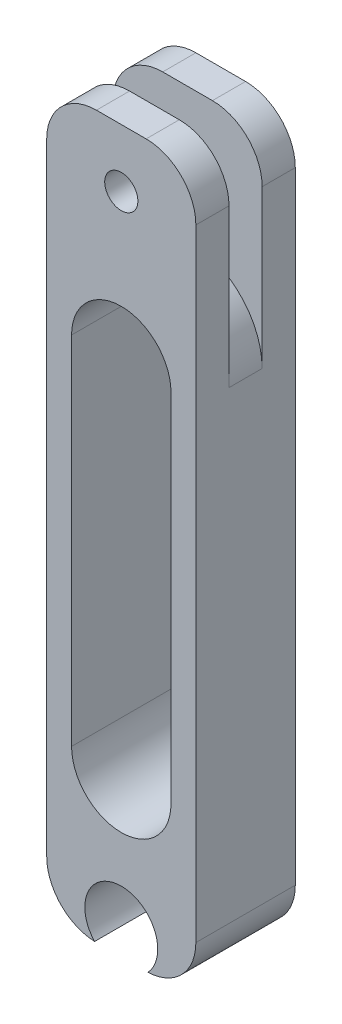
ISO-10303-21;
HEADER;
FILE_DESCRIPTION(('STEP AP214'),'2;1');
FILE_NAME('part.step','',(''),(''),'','','');
FILE_SCHEMA(('AUTOMOTIVE_DESIGN { 1 0 10303 214 1 1 1 1 }'));
ENDSEC;
DATA;
#1=APPLICATION_CONTEXT('core data for automotive mechanical design processes');
#2=APPLICATION_PROTOCOL_DEFINITION('international standard','automotive_design',2000,#1);
#3=PRODUCT_CONTEXT('',#1,'mechanical');
#4=PRODUCT('Part','Part','',(#3));
#5=PRODUCT_RELATED_PRODUCT_CATEGORY('part','',(#4));
#6=PRODUCT_DEFINITION_FORMATION('','',#4);
#7=PRODUCT_DEFINITION_CONTEXT('part definition',#1,'design');
#8=PRODUCT_DEFINITION('design','',#6,#7);
#9=PRODUCT_DEFINITION_SHAPE('','',#8);
#10=(LENGTH_UNIT() NAMED_UNIT(*) SI_UNIT(.MILLI.,.METRE.));
#11=(NAMED_UNIT(*) PLANE_ANGLE_UNIT() SI_UNIT($,.RADIAN.));
#12=(NAMED_UNIT(*) SI_UNIT($,.STERADIAN.) SOLID_ANGLE_UNIT());
#13=UNCERTAINTY_MEASURE_WITH_UNIT(LENGTH_MEASURE(1.E-05),#10,'distance_accuracy_value','');
#14=(GEOMETRIC_REPRESENTATION_CONTEXT(3) GLOBAL_UNCERTAINTY_ASSIGNED_CONTEXT((#13)) GLOBAL_UNIT_ASSIGNED_CONTEXT((#10,
#11,#12)) REPRESENTATION_CONTEXT('',''));
#15=CARTESIAN_POINT('',(0.,0.,0.));
#16=DIRECTION('',(0.,0.,1.));
#17=DIRECTION('',(1.,0.,0.));
#18=AXIS2_PLACEMENT_3D('',#15,#16,#17);
#19=CARTESIAN_POINT('',(-4.5,42.,6.));
#20=DIRECTION('',(0.,-1.,0.));
#21=DIRECTION('',(0.,0.,-1.));
#22=AXIS2_PLACEMENT_3D('',#19,#20,#21);
#23=PLANE('',#22);
#24=DIRECTION('',(-1.,0.,0.));
#25=VECTOR('',#24,1.);
#26=CARTESIAN_POINT('',(-4.5,42.,0.));
#27=LINE('',#26,#25);
#28=CARTESIAN_POINT('',(1.5,42.,0.));
#29=VERTEX_POINT('',#28);
#30=CARTESIAN_POINT('',(-1.5,42.,0.));
#31=VERTEX_POINT('',#30);
#32=EDGE_CURVE('E235',#29,#31,#27,.T.);
#33=ORIENTED_EDGE('',*,*,#32,.T.);
#34=DIRECTION('',(0.,0.,-1.));
#35=VECTOR('',#34,1.);
#36=CARTESIAN_POINT('',(-1.5,42.,6.));
#37=LINE('',#36,#35);
#38=CARTESIAN_POINT('',(-1.5,42.,2.));
#39=VERTEX_POINT('',#38);
#40=EDGE_CURVE('E317',#31,#39,#37,.F.);
#41=ORIENTED_EDGE('',*,*,#40,.T.);
#42=DIRECTION('',(-1.,0.,0.));
#43=VECTOR('',#42,1.);
#44=CARTESIAN_POINT('',(-4.5,42.,2.));
#45=LINE('',#44,#43);
#46=CARTESIAN_POINT('',(1.5,42.,2.));
#47=VERTEX_POINT('',#46);
#48=EDGE_CURVE('E207',#47,#39,#45,.T.);
#49=ORIENTED_EDGE('',*,*,#48,.F.);
#50=DIRECTION('',(0.,0.,-1.));
#51=VECTOR('',#50,1.);
#52=CARTESIAN_POINT('',(1.5,42.,6.));
#53=LINE('',#52,#51);
#54=EDGE_CURVE('E314',#47,#29,#53,.T.);
#55=ORIENTED_EDGE('',*,*,#54,.T.);
#56=EDGE_LOOP('',(#33,#41,#49,#55));
#57=FACE_BOUND('',#56,.T.);
#58=ADVANCED_FACE('F37',(#57),#23,.F.);
#59=CARTESIAN_POINT('',(0.,38.5,6.));
#60=DIRECTION('',(0.,0.,-1.));
#61=DIRECTION('',(-1.,0.,0.));
#62=AXIS2_PLACEMENT_3D('',#59,#60,#61);
#63=CYLINDRICAL_SURFACE('',#62,1.);
#64=CARTESIAN_POINT('',(0.,38.5,2.));
#65=DIRECTION('',(0.,0.,-1.));
#66=DIRECTION('',(-1.,0.,0.));
#67=AXIS2_PLACEMENT_3D('',#64,#65,#66);
#68=CIRCLE('',#67,1.);
#69=CARTESIAN_POINT('',(-1.,38.5,2.));
#70=VERTEX_POINT('',#69);
#71=EDGE_CURVE('E230',#70,#70,#68,.T.);
#72=ORIENTED_EDGE('',*,*,#71,.F.);
#73=EDGE_LOOP('',(#72));
#74=FACE_BOUND('',#73,.T.);
#75=CARTESIAN_POINT('',(0.,38.5,0.));
#76=DIRECTION('',(0.,0.,1.));
#77=DIRECTION('',(1.,0.,0.));
#78=AXIS2_PLACEMENT_3D('',#75,#76,#77);
#79=CIRCLE('',#78,1.);
#80=CARTESIAN_POINT('',(1.,38.5,0.));
#81=VERTEX_POINT('',#80);
#82=EDGE_CURVE('E227',#81,#81,#79,.T.);
#83=ORIENTED_EDGE('',*,*,#82,.F.);
#84=EDGE_LOOP('',(#83));
#85=FACE_BOUND('',#84,.T.);
#86=ADVANCED_FACE('F403',(#74,#85),#63,.F.);
#87=CARTESIAN_POINT('',(0.,0.,6.));
#88=DIRECTION('',(0.,0.,-1.));
#89=DIRECTION('',(-1.,0.,0.));
#90=AXIS2_PLACEMENT_3D('',#87,#88,#89);
#91=PLANE('',#90);
#92=DIRECTION('',(0.,1.,0.));
#93=VECTOR('',#92,1.);
#94=CARTESIAN_POINT('',(3.,8.,6.));
#95=LINE('',#94,#93);
#96=CARTESIAN_POINT('',(3.,8.,6.));
#97=VERTEX_POINT('',#96);
#98=CARTESIAN_POINT('',(3.,29.5,6.));
#99=VERTEX_POINT('',#98);
#100=EDGE_CURVE('E194',#97,#99,#95,.T.);
#101=ORIENTED_EDGE('',*,*,#100,.F.);
#102=CARTESIAN_POINT('',(0.,8.,6.));
#103=DIRECTION('',(0.,0.,1.));
#104=DIRECTION('',(1.,0.,0.));
#105=AXIS2_PLACEMENT_3D('',#102,#103,#104);
#106=CIRCLE('',#105,3.);
#107=CARTESIAN_POINT('',(-3.,8.,6.));
#108=VERTEX_POINT('',#107);
#109=EDGE_CURVE('E52',#108,#97,#106,.T.);
#110=ORIENTED_EDGE('',*,*,#109,.F.);
#111=DIRECTION('',(0.,-1.,0.));
#112=VECTOR('',#111,1.);
#113=CARTESIAN_POINT('',(-3.,8.,6.));
#114=LINE('',#113,#112);
#115=CARTESIAN_POINT('',(-3.,29.5,6.));
#116=VERTEX_POINT('',#115);
#117=EDGE_CURVE('E185',#116,#108,#114,.T.);
#118=ORIENTED_EDGE('',*,*,#117,.F.);
#119=CARTESIAN_POINT('',(0.,29.5,6.));
#120=DIRECTION('',(0.,0.,1.));
#121=DIRECTION('',(1.,0.,0.));
#122=AXIS2_PLACEMENT_3D('',#119,#120,#121);
#123=CIRCLE('',#122,3.);
#124=EDGE_CURVE('E188',#99,#116,#123,.T.);
#125=ORIENTED_EDGE('',*,*,#124,.F.);
#126=EDGE_LOOP('',(#101,#110,#118,#125));
#127=FACE_BOUND('',#126,.T.);
#128=DIRECTION('',(-1.,0.,0.));
#129=VECTOR('',#128,1.);
#130=CARTESIAN_POINT('',(-4.5,42.,6.));
#131=LINE('',#130,#129);
#132=CARTESIAN_POINT('',(1.5,42.,6.));
#133=VERTEX_POINT('',#132);
#134=CARTESIAN_POINT('',(-1.5,42.,6.));
#135=VERTEX_POINT('',#134);
#136=EDGE_CURVE('E240',#133,#135,#131,.T.);
#137=ORIENTED_EDGE('',*,*,#136,.T.);
#138=CARTESIAN_POINT('',(-1.5,39.,6.));
#139=DIRECTION('',(0.,0.,-1.));
#140=DIRECTION('',(-1.,0.,0.));
#141=AXIS2_PLACEMENT_3D('',#138,#139,#140);
#142=CIRCLE('',#141,3.);
#143=CARTESIAN_POINT('',(-4.5,39.,6.));
#144=VERTEX_POINT('',#143);
#145=EDGE_CURVE('E304',#135,#144,#142,.F.);
#146=ORIENTED_EDGE('',*,*,#145,.T.);
#147=DIRECTION('',(0.,-1.,0.));
#148=VECTOR('',#147,1.);
#149=CARTESIAN_POINT('',(-4.5,-1.5,6.));
#150=LINE('',#149,#148);
#151=CARTESIAN_POINT('',(-4.5,1.49800651797646,6.));
#152=VERTEX_POINT('',#151);
#153=EDGE_CURVE('E231',#144,#152,#150,.T.);
#154=ORIENTED_EDGE('',*,*,#153,.T.);
#155=CARTESIAN_POINT('',(-1.5,1.49800651797646,6.));
#156=DIRECTION('',(0.,0.,-1.));
#157=DIRECTION('',(-1.,0.,0.));
#158=AXIS2_PLACEMENT_3D('',#155,#156,#157);
#159=CIRCLE('',#158,3.);
#160=CARTESIAN_POINT('',(-1.60934769394311,-1.5,6.));
#161=VERTEX_POINT('',#160);
#162=EDGE_CURVE('E298',#152,#161,#159,.F.);
#163=ORIENTED_EDGE('',*,*,#162,.T.);
#164=CARTESIAN_POINT('',(0.,0.,6.));
#165=DIRECTION('',(0.,0.,-1.));
#166=DIRECTION('',(-1.,0.,0.));
#167=AXIS2_PLACEMENT_3D('',#164,#165,#166);
#168=CIRCLE('',#167,2.2);
#169=CARTESIAN_POINT('',(1.60934769394311,-1.5,6.));
#170=VERTEX_POINT('',#169);
#171=EDGE_CURVE('E234',#161,#170,#168,.T.);
#172=ORIENTED_EDGE('',*,*,#171,.T.);
#173=CARTESIAN_POINT('',(1.5,1.49800651797646,6.));
#174=DIRECTION('',(0.,0.,-1.));
#175=DIRECTION('',(-1.,0.,0.));
#176=AXIS2_PLACEMENT_3D('',#173,#174,#175);
#177=CIRCLE('',#176,3.);
#178=CARTESIAN_POINT('',(4.5,1.49800651797646,6.));
#179=VERTEX_POINT('',#178);
#180=EDGE_CURVE('E300',#170,#179,#177,.F.);
#181=ORIENTED_EDGE('',*,*,#180,.T.);
#182=DIRECTION('',(0.,1.,0.));
#183=VECTOR('',#182,1.);
#184=CARTESIAN_POINT('',(4.5,-1.5,6.));
#185=LINE('',#184,#183);
#186=CARTESIAN_POINT('',(4.5,39.,6.));
#187=VERTEX_POINT('',#186);
#188=EDGE_CURVE('E237',#179,#187,#185,.T.);
#189=ORIENTED_EDGE('',*,*,#188,.T.);
#190=CARTESIAN_POINT('',(1.5,39.,6.));
#191=DIRECTION('',(0.,0.,-1.));
#192=DIRECTION('',(-1.,0.,0.));
#193=AXIS2_PLACEMENT_3D('',#190,#191,#192);
#194=CIRCLE('',#193,3.);
#195=EDGE_CURVE('E302',#187,#133,#194,.F.);
#196=ORIENTED_EDGE('',*,*,#195,.T.);
#197=EDGE_LOOP('',(#137,#146,#154,#163,#172,#181,#189,#196));
#198=FACE_BOUND('',#197,.T.);
#199=CARTESIAN_POINT('',(0.,38.5,6.));
#200=DIRECTION('',(0.,0.,1.));
#201=DIRECTION('',(1.,0.,0.));
#202=AXIS2_PLACEMENT_3D('',#199,#200,#201);
#203=CIRCLE('',#202,1.);
#204=CARTESIAN_POINT('',(1.,38.5,6.));
#205=VERTEX_POINT('',#204);
#206=EDGE_CURVE('E223',#205,#205,#203,.T.);
#207=ORIENTED_EDGE('',*,*,#206,.F.);
#208=EDGE_LOOP('',(#207));
#209=FACE_BOUND('',#208,.T.);
#210=ADVANCED_FACE('F333',(#127,#198,#209),#91,.F.);
#211=CARTESIAN_POINT('',(0.,0.,0.));
#212=DIRECTION('',(0.,0.,-1.));
#213=DIRECTION('',(-1.,0.,0.));
#214=AXIS2_PLACEMENT_3D('',#211,#212,#213);
#215=PLANE('',#214);
#216=CARTESIAN_POINT('',(0.,8.,0.));
#217=DIRECTION('',(0.,0.,1.));
#218=DIRECTION('',(1.,0.,0.));
#219=AXIS2_PLACEMENT_3D('',#216,#217,#218);
#220=CIRCLE('',#219,3.);
#221=CARTESIAN_POINT('',(-3.,8.,0.));
#222=VERTEX_POINT('',#221);
#223=CARTESIAN_POINT('',(3.,8.,0.));
#224=VERTEX_POINT('',#223);
#225=EDGE_CURVE('E169',#222,#224,#220,.T.);
#226=ORIENTED_EDGE('',*,*,#225,.T.);
#227=DIRECTION('',(0.,1.,0.));
#228=VECTOR('',#227,1.);
#229=CARTESIAN_POINT('',(3.,8.,0.));
#230=LINE('',#229,#228);
#231=CARTESIAN_POINT('',(3.,29.5,0.));
#232=VERTEX_POINT('',#231);
#233=EDGE_CURVE('E178',#224,#232,#230,.T.);
#234=ORIENTED_EDGE('',*,*,#233,.T.);
#235=CARTESIAN_POINT('',(0.,29.5,0.));
#236=DIRECTION('',(0.,0.,1.));
#237=DIRECTION('',(1.,0.,0.));
#238=AXIS2_PLACEMENT_3D('',#235,#236,#237);
#239=CIRCLE('',#238,3.);
#240=CARTESIAN_POINT('',(-3.,29.5,0.));
#241=VERTEX_POINT('',#240);
#242=EDGE_CURVE('E60',#232,#241,#239,.T.);
#243=ORIENTED_EDGE('',*,*,#242,.T.);
#244=DIRECTION('',(0.,-1.,0.));
#245=VECTOR('',#244,1.);
#246=CARTESIAN_POINT('',(-3.,8.,0.));
#247=LINE('',#246,#245);
#248=EDGE_CURVE('E175',#241,#222,#247,.T.);
#249=ORIENTED_EDGE('',*,*,#248,.T.);
#250=EDGE_LOOP('',(#226,#234,#243,#249));
#251=FACE_BOUND('',#250,.T.);
#252=DIRECTION('',(0.,-1.,0.));
#253=VECTOR('',#252,1.);
#254=CARTESIAN_POINT('',(-4.5,-1.5,0.));
#255=LINE('',#254,#253);
#256=CARTESIAN_POINT('',(-4.5,39.,0.));
#257=VERTEX_POINT('',#256);
#258=CARTESIAN_POINT('',(-4.5,1.49800651797646,0.));
#259=VERTEX_POINT('',#258);
#260=EDGE_CURVE('E226',#257,#259,#255,.T.);
#261=ORIENTED_EDGE('',*,*,#260,.F.);
#262=CARTESIAN_POINT('',(-1.5,39.,0.));
#263=DIRECTION('',(0.,0.,-1.));
#264=DIRECTION('',(-1.,0.,0.));
#265=AXIS2_PLACEMENT_3D('',#262,#263,#264);
#266=CIRCLE('',#265,3.);
#267=EDGE_CURVE('E312',#257,#31,#266,.T.);
#268=ORIENTED_EDGE('',*,*,#267,.T.);
#269=ORIENTED_EDGE('',*,*,#32,.F.);
#270=CARTESIAN_POINT('',(1.5,39.,0.));
#271=DIRECTION('',(0.,0.,-1.));
#272=DIRECTION('',(-1.,0.,0.));
#273=AXIS2_PLACEMENT_3D('',#270,#271,#272);
#274=CIRCLE('',#273,3.);
#275=CARTESIAN_POINT('',(4.5,39.,0.));
#276=VERTEX_POINT('',#275);
#277=EDGE_CURVE('E310',#29,#276,#274,.T.);
#278=ORIENTED_EDGE('',*,*,#277,.T.);
#279=DIRECTION('',(0.,1.,0.));
#280=VECTOR('',#279,1.);
#281=CARTESIAN_POINT('',(4.5,-1.5,0.));
#282=LINE('',#281,#280);
#283=CARTESIAN_POINT('',(4.5,1.49800651797646,0.));
#284=VERTEX_POINT('',#283);
#285=EDGE_CURVE('E249',#284,#276,#282,.T.);
#286=ORIENTED_EDGE('',*,*,#285,.F.);
#287=CARTESIAN_POINT('',(1.5,1.49800651797646,0.));
#288=DIRECTION('',(0.,0.,-1.));
#289=DIRECTION('',(-1.,0.,0.));
#290=AXIS2_PLACEMENT_3D('',#287,#288,#289);
#291=CIRCLE('',#290,3.);
#292=CARTESIAN_POINT('',(1.60934769394311,-1.5,0.));
#293=VERTEX_POINT('',#292);
#294=EDGE_CURVE('E308',#284,#293,#291,.T.);
#295=ORIENTED_EDGE('',*,*,#294,.T.);
#296=CARTESIAN_POINT('',(0.,0.,0.));
#297=DIRECTION('',(0.,0.,-1.));
#298=DIRECTION('',(-1.,0.,0.));
#299=AXIS2_PLACEMENT_3D('',#296,#297,#298);
#300=CIRCLE('',#299,2.2);
#301=CARTESIAN_POINT('',(-1.60934769394311,-1.5,0.));
#302=VERTEX_POINT('',#301);
#303=EDGE_CURVE('E246',#302,#293,#300,.T.);
#304=ORIENTED_EDGE('',*,*,#303,.F.);
#305=CARTESIAN_POINT('',(-1.5,1.49800651797646,0.));
#306=DIRECTION('',(0.,0.,-1.));
#307=DIRECTION('',(-1.,0.,0.));
#308=AXIS2_PLACEMENT_3D('',#305,#306,#307);
#309=CIRCLE('',#308,3.);
#310=EDGE_CURVE('E306',#302,#259,#309,.T.);
#311=ORIENTED_EDGE('',*,*,#310,.T.);
#312=EDGE_LOOP('',(#261,#268,#269,#278,#286,#295,#304,#311));
#313=FACE_BOUND('',#312,.T.);
#314=ORIENTED_EDGE('',*,*,#82,.T.);
#315=EDGE_LOOP('',(#314));
#316=FACE_BOUND('',#315,.T.);
#317=ADVANCED_FACE('F182',(#251,#313,#316),#215,.T.);
#318=CARTESIAN_POINT('',(-4.5,-1.5,6.));
#319=DIRECTION('',(1.,0.,0.));
#320=DIRECTION('',(0.,0.,-1.));
#321=AXIS2_PLACEMENT_3D('',#318,#319,#320);
#322=PLANE('',#321);
#323=ORIENTED_EDGE('',*,*,#153,.F.);
#324=DIRECTION('',(0.,0.,-1.));
#325=VECTOR('',#324,1.);
#326=CARTESIAN_POINT('',(-4.5,39.,6.));
#327=LINE('',#326,#325);
#328=CARTESIAN_POINT('',(-4.5,39.,4.));
#329=VERTEX_POINT('',#328);
#330=EDGE_CURVE('E286',#144,#329,#327,.T.);
#331=ORIENTED_EDGE('',*,*,#330,.T.);
#332=DIRECTION('',(0.,1.,0.));
#333=VECTOR('',#332,1.);
#334=CARTESIAN_POINT('',(-4.5,34.,4.));
#335=LINE('',#334,#333);
#336=CARTESIAN_POINT('',(-4.5,29.5,4.));
#337=VERTEX_POINT('',#336);
#338=EDGE_CURVE('E210',#337,#329,#335,.T.);
#339=ORIENTED_EDGE('',*,*,#338,.F.);
#340=DIRECTION('',(0.,0.,1.));
#341=VECTOR('',#340,1.);
#342=CARTESIAN_POINT('',(-4.5,29.5,2.));
#343=LINE('',#342,#341);
#344=CARTESIAN_POINT('',(-4.5,29.5,2.));
#345=VERTEX_POINT('',#344);
#346=EDGE_CURVE('E259',#337,#345,#343,.F.);
#347=ORIENTED_EDGE('',*,*,#346,.T.);
#348=DIRECTION('',(0.,1.,0.));
#349=VECTOR('',#348,1.);
#350=CARTESIAN_POINT('',(-4.5,34.,2.));
#351=LINE('',#350,#349);
#352=CARTESIAN_POINT('',(-4.5,39.,2.));
#353=VERTEX_POINT('',#352);
#354=EDGE_CURVE('E211',#345,#353,#351,.T.);
#355=ORIENTED_EDGE('',*,*,#354,.T.);
#356=DIRECTION('',(0.,0.,-1.));
#357=VECTOR('',#356,1.);
#358=CARTESIAN_POINT('',(-4.5,39.,6.));
#359=LINE('',#358,#357);
#360=EDGE_CURVE('E283',#353,#257,#359,.T.);
#361=ORIENTED_EDGE('',*,*,#360,.T.);
#362=ORIENTED_EDGE('',*,*,#260,.T.);
#363=DIRECTION('',(0.,0.,-1.));
#364=VECTOR('',#363,1.);
#365=CARTESIAN_POINT('',(-4.5,1.49800651797646,6.));
#366=LINE('',#365,#364);
#367=EDGE_CURVE('E279',#259,#152,#366,.F.);
#368=ORIENTED_EDGE('',*,*,#367,.T.);
#369=EDGE_LOOP('',(#323,#331,#339,#347,#355,#361,#362,#368));
#370=FACE_BOUND('',#369,.T.);
#371=ADVANCED_FACE('F351',(#370),#322,.F.);
#372=CARTESIAN_POINT('',(0.,0.,6.));
#373=DIRECTION('',(0.,0.,-1.));
#374=DIRECTION('',(-1.,0.,0.));
#375=AXIS2_PLACEMENT_3D('',#372,#373,#374);
#376=CYLINDRICAL_SURFACE('',#375,2.2);
#377=ORIENTED_EDGE('',*,*,#303,.T.);
#378=DIRECTION('',(0.,0.,-1.));
#379=VECTOR('',#378,1.);
#380=CARTESIAN_POINT('',(1.60934769394311,-1.5,6.));
#381=LINE('',#380,#379);
#382=EDGE_CURVE('E243',#170,#293,#381,.T.);
#383=ORIENTED_EDGE('',*,*,#382,.F.);
#384=ORIENTED_EDGE('',*,*,#171,.F.);
#385=DIRECTION('',(0.,0.,-1.));
#386=VECTOR('',#385,1.);
#387=CARTESIAN_POINT('',(-1.60934769394311,-1.5,6.));
#388=LINE('',#387,#386);
#389=EDGE_CURVE('E256',#161,#302,#388,.T.);
#390=ORIENTED_EDGE('',*,*,#389,.T.);
#391=EDGE_LOOP('',(#377,#383,#384,#390));
#392=FACE_BOUND('',#391,.T.);
#393=ADVANCED_FACE('F359',(#392),#376,.F.);
#394=CARTESIAN_POINT('',(4.5,-1.5,6.));
#395=DIRECTION('',(-1.,0.,0.));
#396=DIRECTION('',(0.,0.,1.));
#397=AXIS2_PLACEMENT_3D('',#394,#395,#396);
#398=PLANE('',#397);
#399=ORIENTED_EDGE('',*,*,#285,.T.);
#400=DIRECTION('',(0.,0.,-1.));
#401=VECTOR('',#400,1.);
#402=CARTESIAN_POINT('',(4.5,39.,6.));
#403=LINE('',#402,#401);
#404=CARTESIAN_POINT('',(4.5,39.,2.));
#405=VERTEX_POINT('',#404);
#406=EDGE_CURVE('E11',#276,#405,#403,.F.);
#407=ORIENTED_EDGE('',*,*,#406,.T.);
#408=DIRECTION('',(0.,1.,0.));
#409=VECTOR('',#408,1.);
#410=CARTESIAN_POINT('',(4.5,34.,2.));
#411=LINE('',#410,#409);
#412=CARTESIAN_POINT('',(4.5,29.5,2.));
#413=VERTEX_POINT('',#412);
#414=EDGE_CURVE('E215',#413,#405,#411,.T.);
#415=ORIENTED_EDGE('',*,*,#414,.F.);
#416=DIRECTION('',(0.,0.,-1.));
#417=VECTOR('',#416,1.);
#418=CARTESIAN_POINT('',(4.5,29.5,4.));
#419=LINE('',#418,#417);
#420=CARTESIAN_POINT('',(4.5,29.5,4.));
#421=VERTEX_POINT('',#420);
#422=EDGE_CURVE('E266',#413,#421,#419,.F.);
#423=ORIENTED_EDGE('',*,*,#422,.T.);
#424=DIRECTION('',(0.,1.,0.));
#425=VECTOR('',#424,1.);
#426=CARTESIAN_POINT('',(4.5,34.,4.));
#427=LINE('',#426,#425);
#428=CARTESIAN_POINT('',(4.5,39.,4.));
#429=VERTEX_POINT('',#428);
#430=EDGE_CURVE('E218',#421,#429,#427,.T.);
#431=ORIENTED_EDGE('',*,*,#430,.T.);
#432=DIRECTION('',(0.,0.,-1.));
#433=VECTOR('',#432,1.);
#434=CARTESIAN_POINT('',(4.5,39.,6.));
#435=LINE('',#434,#433);
#436=EDGE_CURVE('E45',#429,#187,#435,.F.);
#437=ORIENTED_EDGE('',*,*,#436,.T.);
#438=ORIENTED_EDGE('',*,*,#188,.F.);
#439=DIRECTION('',(0.,0.,-1.));
#440=VECTOR('',#439,1.);
#441=CARTESIAN_POINT('',(4.5,1.49800651797646,6.));
#442=LINE('',#441,#440);
#443=EDGE_CURVE('E323',#179,#284,#442,.T.);
#444=ORIENTED_EDGE('',*,*,#443,.T.);
#445=EDGE_LOOP('',(#399,#407,#415,#423,#431,#437,#438,#444));
#446=FACE_BOUND('',#445,.T.);
#447=ADVANCED_FACE('F328',(#446),#398,.F.);
#448=DIRECTION('',(1.,0.,0.));
#449=VECTOR('',#448,1.);
#450=CARTESIAN_POINT('',(-4.5,42.,4.));
#451=LINE('',#450,#449);
#452=CARTESIAN_POINT('',(-1.5,42.,4.));
#453=VERTEX_POINT('',#452);
#454=CARTESIAN_POINT('',(1.5,42.,4.));
#455=VERTEX_POINT('',#454);
#456=EDGE_CURVE('E204',#453,#455,#451,.T.);
#457=ORIENTED_EDGE('',*,*,#456,.F.);
#458=DIRECTION('',(0.,0.,-1.));
#459=VECTOR('',#458,1.);
#460=CARTESIAN_POINT('',(-1.5,42.,6.));
#461=LINE('',#460,#459);
#462=EDGE_CURVE('E296',#453,#135,#461,.F.);
#463=ORIENTED_EDGE('',*,*,#462,.T.);
#464=ORIENTED_EDGE('',*,*,#136,.F.);
#465=DIRECTION('',(0.,0.,-1.));
#466=VECTOR('',#465,1.);
#467=CARTESIAN_POINT('',(1.5,42.,6.));
#468=LINE('',#467,#466);
#469=EDGE_CURVE('E293',#133,#455,#468,.T.);
#470=ORIENTED_EDGE('',*,*,#469,.T.);
#471=EDGE_LOOP('',(#457,#463,#464,#470));
#472=FACE_BOUND('',#471,.T.);
#473=ADVANCED_FACE('F341',(#472),#23,.F.);
#474=CARTESIAN_POINT('',(0.,38.5,4.));
#475=DIRECTION('',(0.,0.,1.));
#476=DIRECTION('',(1.,0.,0.));
#477=AXIS2_PLACEMENT_3D('',#474,#475,#476);
#478=CIRCLE('',#477,1.);
#479=CARTESIAN_POINT('',(1.,38.5,4.));
#480=VERTEX_POINT('',#479);
#481=EDGE_CURVE('E214',#480,#480,#478,.T.);
#482=ORIENTED_EDGE('',*,*,#481,.F.);
#483=EDGE_LOOP('',(#482));
#484=FACE_BOUND('',#483,.T.);
#485=ORIENTED_EDGE('',*,*,#206,.T.);
#486=EDGE_LOOP('',(#485));
#487=FACE_BOUND('',#486,.T.);
#488=ADVANCED_FACE('F410',(#484,#487),#63,.F.);
#489=CARTESIAN_POINT('',(-4.5,34.,2.));
#490=DIRECTION('',(0.,0.,-1.));
#491=DIRECTION('',(-1.,0.,0.));
#492=AXIS2_PLACEMENT_3D('',#489,#490,#491);
#493=PLANE('',#492);
#494=ORIENTED_EDGE('',*,*,#71,.T.);
#495=EDGE_LOOP('',(#494));
#496=FACE_BOUND('',#495,.T.);
#497=ORIENTED_EDGE('',*,*,#48,.T.);
#498=CARTESIAN_POINT('',(-1.5,39.,2.));
#499=DIRECTION('',(0.,0.,-1.));
#500=DIRECTION('',(-1.,0.,0.));
#501=AXIS2_PLACEMENT_3D('',#498,#499,#500);
#502=CIRCLE('',#501,3.);
#503=EDGE_CURVE('E321',#39,#353,#502,.F.);
#504=ORIENTED_EDGE('',*,*,#503,.T.);
#505=ORIENTED_EDGE('',*,*,#354,.F.);
#506=CARTESIAN_POINT('',(0.,29.5,2.));
#507=DIRECTION('',(0.,0.,-1.));
#508=DIRECTION('',(-1.,0.,0.));
#509=AXIS2_PLACEMENT_3D('',#506,#507,#508);
#510=CIRCLE('',#509,4.5);
#511=CARTESIAN_POINT('',(0.,34.,2.));
#512=VERTEX_POINT('',#511);
#513=EDGE_CURVE('E272',#345,#512,#510,.T.);
#514=ORIENTED_EDGE('',*,*,#513,.T.);
#515=CARTESIAN_POINT('',(0.,29.5,2.));
#516=DIRECTION('',(0.,0.,-1.));
#517=DIRECTION('',(-1.,0.,0.));
#518=AXIS2_PLACEMENT_3D('',#515,#516,#517);
#519=CIRCLE('',#518,4.5);
#520=EDGE_CURVE('E274',#512,#413,#519,.T.);
#521=ORIENTED_EDGE('',*,*,#520,.T.);
#522=ORIENTED_EDGE('',*,*,#414,.T.);
#523=CARTESIAN_POINT('',(1.5,39.,2.));
#524=DIRECTION('',(0.,0.,-1.));
#525=DIRECTION('',(-1.,0.,0.));
#526=AXIS2_PLACEMENT_3D('',#523,#524,#525);
#527=CIRCLE('',#526,3.);
#528=EDGE_CURVE('E319',#405,#47,#527,.F.);
#529=ORIENTED_EDGE('',*,*,#528,.T.);
#530=EDGE_LOOP('',(#497,#504,#505,#514,#521,#522,#529));
#531=FACE_BOUND('',#530,.T.);
#532=ADVANCED_FACE('F373',(#496,#531),#493,.F.);
#533=CARTESIAN_POINT('',(-4.5,34.,4.));
#534=DIRECTION('',(0.,0.,1.));
#535=DIRECTION('',(1.,0.,0.));
#536=AXIS2_PLACEMENT_3D('',#533,#534,#535);
#537=PLANE('',#536);
#538=ORIENTED_EDGE('',*,*,#481,.T.);
#539=EDGE_LOOP('',(#538));
#540=FACE_BOUND('',#539,.T.);
#541=ORIENTED_EDGE('',*,*,#338,.T.);
#542=CARTESIAN_POINT('',(-1.5,39.,4.));
#543=DIRECTION('',(0.,0.,1.));
#544=DIRECTION('',(1.,0.,0.));
#545=AXIS2_PLACEMENT_3D('',#542,#543,#544);
#546=CIRCLE('',#545,3.);
#547=EDGE_CURVE('E291',#329,#453,#546,.F.);
#548=ORIENTED_EDGE('',*,*,#547,.T.);
#549=ORIENTED_EDGE('',*,*,#456,.T.);
#550=CARTESIAN_POINT('',(1.5,39.,4.));
#551=DIRECTION('',(0.,0.,1.));
#552=DIRECTION('',(1.,0.,0.));
#553=AXIS2_PLACEMENT_3D('',#550,#551,#552);
#554=CIRCLE('',#553,3.);
#555=EDGE_CURVE('E289',#455,#429,#554,.F.);
#556=ORIENTED_EDGE('',*,*,#555,.T.);
#557=ORIENTED_EDGE('',*,*,#430,.F.);
#558=CARTESIAN_POINT('',(0.,29.5,4.));
#559=DIRECTION('',(0.,0.,1.));
#560=DIRECTION('',(1.,0.,0.));
#561=AXIS2_PLACEMENT_3D('',#558,#559,#560);
#562=CIRCLE('',#561,4.5);
#563=CARTESIAN_POINT('',(0.,34.,4.));
#564=VERTEX_POINT('',#563);
#565=EDGE_CURVE('E277',#421,#564,#562,.T.);
#566=ORIENTED_EDGE('',*,*,#565,.T.);
#567=CARTESIAN_POINT('',(0.,29.5,4.));
#568=DIRECTION('',(0.,0.,1.));
#569=DIRECTION('',(1.,0.,0.));
#570=AXIS2_PLACEMENT_3D('',#567,#568,#569);
#571=CIRCLE('',#570,4.5);
#572=EDGE_CURVE('E269',#564,#337,#571,.T.);
#573=ORIENTED_EDGE('',*,*,#572,.T.);
#574=EDGE_LOOP('',(#541,#548,#549,#556,#557,#566,#573));
#575=FACE_BOUND('',#574,.T.);
#576=ADVANCED_FACE('F344',(#540,#575),#537,.F.);
#577=CARTESIAN_POINT('',(0.,29.5,0.));
#578=DIRECTION('',(0.,0.,1.));
#579=DIRECTION('',(1.,0.,0.));
#580=AXIS2_PLACEMENT_3D('',#577,#578,#579);
#581=CYLINDRICAL_SURFACE('',#580,4.5);
#582=ORIENTED_EDGE('',*,*,#422,.F.);
#583=ORIENTED_EDGE('',*,*,#520,.F.);
#584=DIRECTION('',(0.,0.,-1.));
#585=VECTOR('',#584,1.);
#586=CARTESIAN_POINT('',(0.,34.,2.));
#587=LINE('',#586,#585);
#588=EDGE_CURVE('E200',#564,#512,#587,.T.);
#589=ORIENTED_EDGE('',*,*,#588,.F.);
#590=ORIENTED_EDGE('',*,*,#565,.F.);
#591=EDGE_LOOP('',(#582,#583,#589,#590));
#592=FACE_BOUND('',#591,.T.);
#593=ADVANCED_FACE('F390',(#592),#581,.T.);
#594=CARTESIAN_POINT('',(0.,29.5,0.));
#595=DIRECTION('',(0.,0.,-1.));
#596=DIRECTION('',(-1.,0.,0.));
#597=AXIS2_PLACEMENT_3D('',#594,#595,#596);
#598=CYLINDRICAL_SURFACE('',#597,4.5);
#599=ORIENTED_EDGE('',*,*,#513,.F.);
#600=ORIENTED_EDGE('',*,*,#346,.F.);
#601=ORIENTED_EDGE('',*,*,#572,.F.);
#602=ORIENTED_EDGE('',*,*,#588,.T.);
#603=EDGE_LOOP('',(#599,#600,#601,#602));
#604=FACE_BOUND('',#603,.T.);
#605=ADVANCED_FACE('F385',(#604),#598,.T.);
#606=CARTESIAN_POINT('',(-1.5,39.,6.));
#607=DIRECTION('',(0.,0.,-1.));
#608=DIRECTION('',(-1.,0.,0.));
#609=AXIS2_PLACEMENT_3D('',#606,#607,#608);
#610=CYLINDRICAL_SURFACE('',#609,3.);
#611=ORIENTED_EDGE('',*,*,#145,.F.);
#612=ORIENTED_EDGE('',*,*,#462,.F.);
#613=ORIENTED_EDGE('',*,*,#547,.F.);
#614=ORIENTED_EDGE('',*,*,#330,.F.);
#615=EDGE_LOOP('',(#611,#612,#613,#614));
#616=FACE_BOUND('',#615,.T.);
#617=ADVANCED_FACE('F348',(#616),#610,.T.);
#618=CARTESIAN_POINT('',(-1.5,39.,6.));
#619=DIRECTION('',(0.,0.,-1.));
#620=DIRECTION('',(-1.,0.,0.));
#621=AXIS2_PLACEMENT_3D('',#618,#619,#620);
#622=CYLINDRICAL_SURFACE('',#621,3.);
#623=ORIENTED_EDGE('',*,*,#503,.F.);
#624=ORIENTED_EDGE('',*,*,#40,.F.);
#625=ORIENTED_EDGE('',*,*,#267,.F.);
#626=ORIENTED_EDGE('',*,*,#360,.F.);
#627=EDGE_LOOP('',(#623,#624,#625,#626));
#628=FACE_BOUND('',#627,.T.);
#629=ADVANCED_FACE('F379',(#628),#622,.T.);
#630=CARTESIAN_POINT('',(1.5,39.,6.));
#631=DIRECTION('',(0.,0.,-1.));
#632=DIRECTION('',(-1.,0.,0.));
#633=AXIS2_PLACEMENT_3D('',#630,#631,#632);
#634=CYLINDRICAL_SURFACE('',#633,3.);
#635=ORIENTED_EDGE('',*,*,#528,.F.);
#636=ORIENTED_EDGE('',*,*,#406,.F.);
#637=ORIENTED_EDGE('',*,*,#277,.F.);
#638=ORIENTED_EDGE('',*,*,#54,.F.);
#639=EDGE_LOOP('',(#635,#636,#637,#638));
#640=FACE_BOUND('',#639,.T.);
#641=ADVANCED_FACE('F369',(#640),#634,.T.);
#642=CARTESIAN_POINT('',(1.5,39.,6.));
#643=DIRECTION('',(0.,0.,-1.));
#644=DIRECTION('',(-1.,0.,0.));
#645=AXIS2_PLACEMENT_3D('',#642,#643,#644);
#646=CYLINDRICAL_SURFACE('',#645,3.);
#647=ORIENTED_EDGE('',*,*,#195,.F.);
#648=ORIENTED_EDGE('',*,*,#436,.F.);
#649=ORIENTED_EDGE('',*,*,#555,.F.);
#650=ORIENTED_EDGE('',*,*,#469,.F.);
#651=EDGE_LOOP('',(#647,#648,#649,#650));
#652=FACE_BOUND('',#651,.T.);
#653=ADVANCED_FACE('F338',(#652),#646,.T.);
#654=CARTESIAN_POINT('',(1.5,1.49800651797646,6.));
#655=DIRECTION('',(0.,0.,-1.));
#656=DIRECTION('',(-1.,0.,0.));
#657=AXIS2_PLACEMENT_3D('',#654,#655,#656);
#658=CYLINDRICAL_SURFACE('',#657,3.);
#659=ORIENTED_EDGE('',*,*,#180,.F.);
#660=ORIENTED_EDGE('',*,*,#382,.T.);
#661=ORIENTED_EDGE('',*,*,#294,.F.);
#662=ORIENTED_EDGE('',*,*,#443,.F.);
#663=EDGE_LOOP('',(#659,#660,#661,#662));
#664=FACE_BOUND('',#663,.T.);
#665=ADVANCED_FACE('F365',(#664),#658,.T.);
#666=CARTESIAN_POINT('',(-1.5,1.49800651797646,6.));
#667=DIRECTION('',(0.,0.,-1.));
#668=DIRECTION('',(-1.,0.,0.));
#669=AXIS2_PLACEMENT_3D('',#666,#667,#668);
#670=CYLINDRICAL_SURFACE('',#669,3.);
#671=ORIENTED_EDGE('',*,*,#162,.F.);
#672=ORIENTED_EDGE('',*,*,#367,.F.);
#673=ORIENTED_EDGE('',*,*,#310,.F.);
#674=ORIENTED_EDGE('',*,*,#389,.F.);
#675=EDGE_LOOP('',(#671,#672,#673,#674));
#676=FACE_BOUND('',#675,.T.);
#677=ADVANCED_FACE('F39',(#676),#670,.T.);
#678=CARTESIAN_POINT('',(0.,8.,0.));
#679=DIRECTION('',(0.,0.,1.));
#680=DIRECTION('',(1.,0.,0.));
#681=AXIS2_PLACEMENT_3D('',#678,#679,#680);
#682=CYLINDRICAL_SURFACE('',#681,3.);
#683=ORIENTED_EDGE('',*,*,#109,.T.);
#684=DIRECTION('',(0.,0.,1.));
#685=VECTOR('',#684,1.);
#686=CARTESIAN_POINT('',(3.,8.,0.));
#687=LINE('',#686,#685);
#688=EDGE_CURVE('E165',#224,#97,#687,.T.);
#689=ORIENTED_EDGE('',*,*,#688,.F.);
#690=ORIENTED_EDGE('',*,*,#225,.F.);
#691=DIRECTION('',(0.,0.,1.));
#692=VECTOR('',#691,1.);
#693=CARTESIAN_POINT('',(-3.,8.,0.));
#694=LINE('',#693,#692);
#695=EDGE_CURVE('E198',#222,#108,#694,.T.);
#696=ORIENTED_EDGE('',*,*,#695,.T.);
#697=EDGE_LOOP('',(#683,#689,#690,#696));
#698=FACE_BOUND('',#697,.T.);
#699=ADVANCED_FACE('F167',(#698),#682,.F.);
#700=CARTESIAN_POINT('',(-3.,8.,0.));
#701=DIRECTION('',(-1.,0.,0.));
#702=DIRECTION('',(0.,0.,1.));
#703=AXIS2_PLACEMENT_3D('',#700,#701,#702);
#704=PLANE('',#703);
#705=ORIENTED_EDGE('',*,*,#117,.T.);
#706=ORIENTED_EDGE('',*,*,#695,.F.);
#707=ORIENTED_EDGE('',*,*,#248,.F.);
#708=DIRECTION('',(0.,0.,1.));
#709=VECTOR('',#708,1.);
#710=CARTESIAN_POINT('',(-3.,29.5,0.));
#711=LINE('',#710,#709);
#712=EDGE_CURVE('E201',#241,#116,#711,.T.);
#713=ORIENTED_EDGE('',*,*,#712,.T.);
#714=EDGE_LOOP('',(#705,#706,#707,#713));
#715=FACE_BOUND('',#714,.T.);
#716=ADVANCED_FACE('F439',(#715),#704,.F.);
#717=CARTESIAN_POINT('',(0.,29.5,0.));
#718=DIRECTION('',(0.,0.,1.));
#719=DIRECTION('',(1.,0.,0.));
#720=AXIS2_PLACEMENT_3D('',#717,#718,#719);
#721=CYLINDRICAL_SURFACE('',#720,3.);
#722=ORIENTED_EDGE('',*,*,#124,.T.);
#723=ORIENTED_EDGE('',*,*,#712,.F.);
#724=ORIENTED_EDGE('',*,*,#242,.F.);
#725=DIRECTION('',(0.,0.,1.));
#726=VECTOR('',#725,1.);
#727=CARTESIAN_POINT('',(3.,29.5,0.));
#728=LINE('',#727,#726);
#729=EDGE_CURVE('E174',#232,#99,#728,.T.);
#730=ORIENTED_EDGE('',*,*,#729,.T.);
#731=EDGE_LOOP('',(#722,#723,#724,#730));
#732=FACE_BOUND('',#731,.T.);
#733=ADVANCED_FACE('F442',(#732),#721,.F.);
#734=CARTESIAN_POINT('',(3.,8.,0.));
#735=DIRECTION('',(1.,0.,0.));
#736=DIRECTION('',(0.,0.,-1.));
#737=AXIS2_PLACEMENT_3D('',#734,#735,#736);
#738=PLANE('',#737);
#739=ORIENTED_EDGE('',*,*,#100,.T.);
#740=ORIENTED_EDGE('',*,*,#729,.F.);
#741=ORIENTED_EDGE('',*,*,#233,.F.);
#742=ORIENTED_EDGE('',*,*,#688,.T.);
#743=EDGE_LOOP('',(#739,#740,#741,#742));
#744=FACE_BOUND('',#743,.T.);
#745=ADVANCED_FACE('F179',(#744),#738,.F.);
#746=CLOSED_SHELL('',(#58,#86,#210,#317,#371,#393,#447,#473,#488,#532,#576,#593,#605,#617,#629,
#641,#653,#665,#677,#699,#716,#733,#745));
#747=MANIFOLD_SOLID_BREP('B2',#746);
#748=ADVANCED_BREP_SHAPE_REPRESENTATION('',(#18,#747),#14);
#749=SHAPE_DEFINITION_REPRESENTATION(#9,#748);
ENDSEC;
END-ISO-10303-21;
